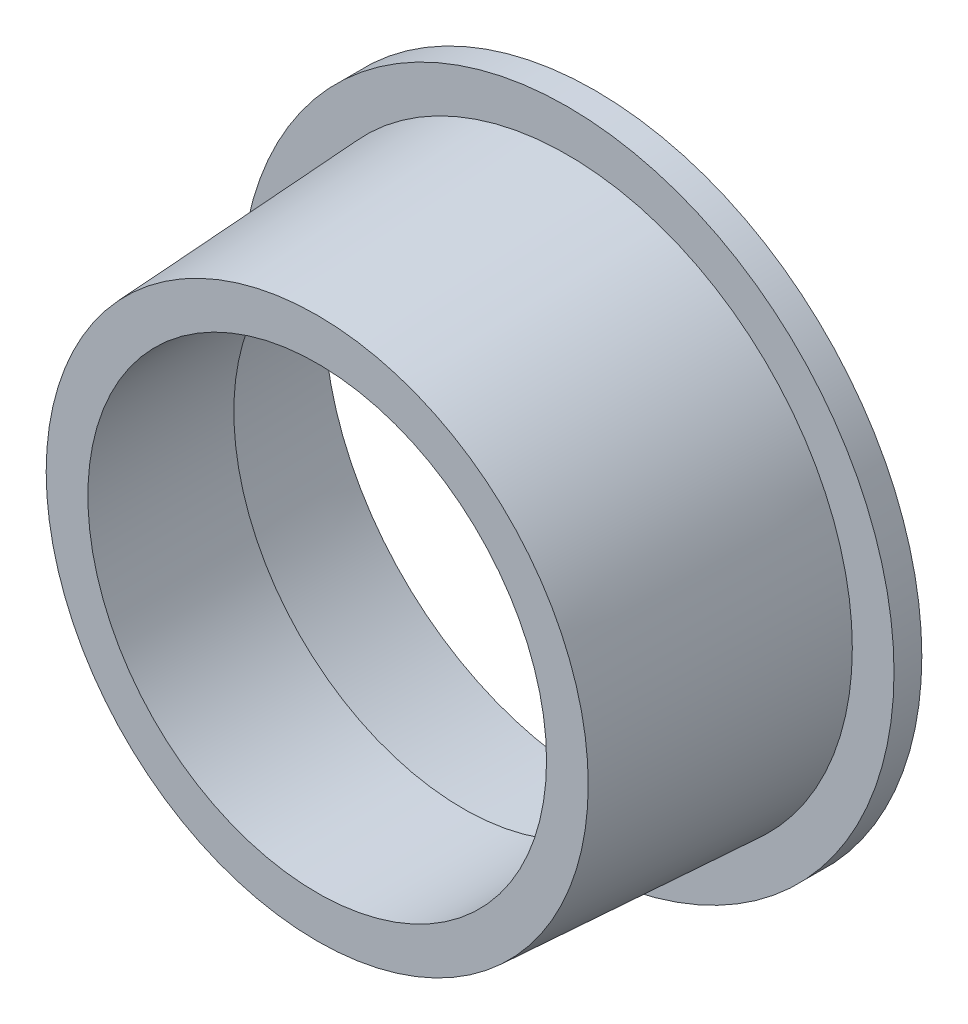
ISO-10303-21;
HEADER;
FILE_DESCRIPTION(('STEP AP214'),'2;1');
FILE_NAME('part.step','',(''),(''),'','','');
FILE_SCHEMA(('AUTOMOTIVE_DESIGN { 1 0 10303 214 1 1 1 1 }'));
ENDSEC;
DATA;
#1=APPLICATION_CONTEXT('core data for automotive mechanical design processes');
#2=APPLICATION_PROTOCOL_DEFINITION('international standard','automotive_design',2000,#1);
#3=PRODUCT_CONTEXT('',#1,'mechanical');
#4=PRODUCT('Part','Part','',(#3));
#5=PRODUCT_RELATED_PRODUCT_CATEGORY('part','',(#4));
#6=PRODUCT_DEFINITION_FORMATION('','',#4);
#7=PRODUCT_DEFINITION_CONTEXT('part definition',#1,'design');
#8=PRODUCT_DEFINITION('design','',#6,#7);
#9=PRODUCT_DEFINITION_SHAPE('','',#8);
#10=(LENGTH_UNIT() NAMED_UNIT(*) SI_UNIT(.MILLI.,.METRE.));
#11=(NAMED_UNIT(*) PLANE_ANGLE_UNIT() SI_UNIT($,.RADIAN.));
#12=(NAMED_UNIT(*) SI_UNIT($,.STERADIAN.) SOLID_ANGLE_UNIT());
#13=UNCERTAINTY_MEASURE_WITH_UNIT(LENGTH_MEASURE(1.E-05),#10,'distance_accuracy_value','');
#14=(GEOMETRIC_REPRESENTATION_CONTEXT(3) GLOBAL_UNCERTAINTY_ASSIGNED_CONTEXT((#13)) GLOBAL_UNIT_ASSIGNED_CONTEXT((#10,
#11,#12)) REPRESENTATION_CONTEXT('',''));
#15=CARTESIAN_POINT('',(0.,0.,0.));
#16=DIRECTION('',(0.,0.,1.));
#17=DIRECTION('',(1.,0.,0.));
#18=AXIS2_PLACEMENT_3D('',#15,#16,#17);
#19=CARTESIAN_POINT('',(-23.5,0.,0.));
#20=DIRECTION('',(0.,0.,1.));
#21=DIRECTION('',(1.,0.,0.));
#22=AXIS2_PLACEMENT_3D('',#19,#20,#21);
#23=PLANE('',#22);
#24=CARTESIAN_POINT('',(0.,0.,0.));
#25=DIRECTION('',(0.,0.,1.));
#26=DIRECTION('',(1.,0.,0.));
#27=AXIS2_PLACEMENT_3D('',#24,#25,#26);
#28=CIRCLE('',#27,23.5);
#29=CARTESIAN_POINT('',(23.5,0.,0.));
#30=VERTEX_POINT('',#29);
#31=EDGE_CURVE('E65',#30,#30,#28,.T.);
#32=ORIENTED_EDGE('',*,*,#31,.F.);
#33=EDGE_LOOP('',(#32));
#34=FACE_BOUND('',#33,.T.);
#35=CARTESIAN_POINT('',(0.,0.,0.));
#36=DIRECTION('',(0.,0.,1.));
#37=DIRECTION('',(1.,0.,0.));
#38=AXIS2_PLACEMENT_3D('',#35,#36,#37);
#39=CIRCLE('',#38,19.5);
#40=CARTESIAN_POINT('',(19.5,0.,0.));
#41=VERTEX_POINT('',#40);
#42=EDGE_CURVE('E10',#41,#41,#39,.T.);
#43=ORIENTED_EDGE('',*,*,#42,.T.);
#44=EDGE_LOOP('',(#43));
#45=FACE_BOUND('',#44,.T.);
#46=ADVANCED_FACE('F37',(#34,#45),#23,.F.);
#47=CARTESIAN_POINT('',(0.,0.,8.));
#48=DIRECTION('',(0.,0.,-1.));
#49=DIRECTION('',(-1.,0.,0.));
#50=AXIS2_PLACEMENT_3D('',#47,#48,#49);
#51=CONICAL_SURFACE('',#50,19.25,0.0312398334302679);
#52=ORIENTED_EDGE('',*,*,#42,.F.);
#53=EDGE_LOOP('',(#52));
#54=FACE_BOUND('',#53,.T.);
#55=CARTESIAN_POINT('',(0.,0.,8.));
#56=DIRECTION('',(0.,0.,1.));
#57=DIRECTION('',(1.,0.,0.));
#58=AXIS2_PLACEMENT_3D('',#55,#56,#57);
#59=CIRCLE('',#58,19.25);
#60=CARTESIAN_POINT('',(19.25,0.,8.));
#61=VERTEX_POINT('',#60);
#62=EDGE_CURVE('E43',#61,#61,#59,.T.);
#63=ORIENTED_EDGE('',*,*,#62,.T.);
#64=EDGE_LOOP('',(#63));
#65=FACE_BOUND('',#64,.T.);
#66=ADVANCED_FACE('F72',(#54,#65),#51,.F.);
#67=CARTESIAN_POINT('',(0.,0.,9.5));
#68=DIRECTION('',(0.,0.,-1.));
#69=DIRECTION('',(-1.,0.,0.));
#70=AXIS2_PLACEMENT_3D('',#67,#68,#69);
#71=CONICAL_SURFACE('',#70,16.5,1.07144960511477);
#72=ORIENTED_EDGE('',*,*,#62,.F.);
#73=EDGE_LOOP('',(#72));
#74=FACE_BOUND('',#73,.T.);
#75=CARTESIAN_POINT('',(0.,0.,9.5));
#76=DIRECTION('',(0.,0.,1.));
#77=DIRECTION('',(1.,0.,0.));
#78=AXIS2_PLACEMENT_3D('',#75,#76,#77);
#79=CIRCLE('',#78,16.5);
#80=CARTESIAN_POINT('',(16.5,0.,9.5));
#81=VERTEX_POINT('',#80);
#82=EDGE_CURVE('E47',#81,#81,#79,.T.);
#83=ORIENTED_EDGE('',*,*,#82,.T.);
#84=EDGE_LOOP('',(#83));
#85=FACE_BOUND('',#84,.T.);
#86=ADVANCED_FACE('F76',(#74,#85),#71,.F.);
#87=CARTESIAN_POINT('',(0.,0.,20.));
#88=DIRECTION('',(0.,0.,1.));
#89=DIRECTION('',(1.,0.,0.));
#90=AXIS2_PLACEMENT_3D('',#87,#88,#89);
#91=CYLINDRICAL_SURFACE('',#90,16.5);
#92=ORIENTED_EDGE('',*,*,#82,.F.);
#93=EDGE_LOOP('',(#92));
#94=FACE_BOUND('',#93,.T.);
#95=CARTESIAN_POINT('',(0.,0.,20.));
#96=DIRECTION('',(0.,0.,1.));
#97=DIRECTION('',(1.,0.,0.));
#98=AXIS2_PLACEMENT_3D('',#95,#96,#97);
#99=CIRCLE('',#98,16.5);
#100=CARTESIAN_POINT('',(16.5,0.,20.));
#101=VERTEX_POINT('',#100);
#102=EDGE_CURVE('E51',#101,#101,#99,.T.);
#103=ORIENTED_EDGE('',*,*,#102,.T.);
#104=EDGE_LOOP('',(#103));
#105=FACE_BOUND('',#104,.T.);
#106=ADVANCED_FACE('F81',(#94,#105),#91,.F.);
#107=CARTESIAN_POINT('',(-19.5,0.,20.));
#108=DIRECTION('',(0.,0.,-1.));
#109=DIRECTION('',(-1.,0.,0.));
#110=AXIS2_PLACEMENT_3D('',#107,#108,#109);
#111=PLANE('',#110);
#112=ORIENTED_EDGE('',*,*,#102,.F.);
#113=EDGE_LOOP('',(#112));
#114=FACE_BOUND('',#113,.T.);
#115=CARTESIAN_POINT('',(0.,0.,20.));
#116=DIRECTION('',(0.,0.,1.));
#117=DIRECTION('',(1.,0.,0.));
#118=AXIS2_PLACEMENT_3D('',#115,#116,#117);
#119=CIRCLE('',#118,19.5);
#120=CARTESIAN_POINT('',(19.5,0.,20.));
#121=VERTEX_POINT('',#120);
#122=EDGE_CURVE('E56',#121,#121,#119,.T.);
#123=ORIENTED_EDGE('',*,*,#122,.T.);
#124=EDGE_LOOP('',(#123));
#125=FACE_BOUND('',#124,.T.);
#126=ADVANCED_FACE('F87',(#114,#125),#111,.F.);
#127=CARTESIAN_POINT('',(0.,0.,2.));
#128=DIRECTION('',(0.,0.,-1.));
#129=DIRECTION('',(-1.,0.,0.));
#130=AXIS2_PLACEMENT_3D('',#127,#128,#129);
#131=CONICAL_SURFACE('',#130,20.5,0.0554985052457169);
#132=ORIENTED_EDGE('',*,*,#122,.F.);
#133=EDGE_LOOP('',(#132));
#134=FACE_BOUND('',#133,.T.);
#135=CARTESIAN_POINT('',(0.,0.,2.));
#136=DIRECTION('',(0.,0.,1.));
#137=DIRECTION('',(1.,0.,0.));
#138=AXIS2_PLACEMENT_3D('',#135,#136,#137);
#139=CIRCLE('',#138,20.5);
#140=CARTESIAN_POINT('',(20.5,0.,2.));
#141=VERTEX_POINT('',#140);
#142=EDGE_CURVE('E59',#141,#141,#139,.T.);
#143=ORIENTED_EDGE('',*,*,#142,.T.);
#144=EDGE_LOOP('',(#143));
#145=FACE_BOUND('',#144,.T.);
#146=ADVANCED_FACE('F91',(#134,#145),#131,.T.);
#147=CARTESIAN_POINT('',(-23.5,0.,2.));
#148=DIRECTION('',(0.,0.,-1.));
#149=DIRECTION('',(-1.,0.,0.));
#150=AXIS2_PLACEMENT_3D('',#147,#148,#149);
#151=PLANE('',#150);
#152=ORIENTED_EDGE('',*,*,#142,.F.);
#153=EDGE_LOOP('',(#152));
#154=FACE_BOUND('',#153,.T.);
#155=CARTESIAN_POINT('',(0.,0.,2.));
#156=DIRECTION('',(0.,0.,1.));
#157=DIRECTION('',(1.,0.,0.));
#158=AXIS2_PLACEMENT_3D('',#155,#156,#157);
#159=CIRCLE('',#158,23.5);
#160=CARTESIAN_POINT('',(23.5,0.,2.));
#161=VERTEX_POINT('',#160);
#162=EDGE_CURVE('E62',#161,#161,#159,.T.);
#163=ORIENTED_EDGE('',*,*,#162,.T.);
#164=EDGE_LOOP('',(#163));
#165=FACE_BOUND('',#164,.T.);
#166=ADVANCED_FACE('F95',(#154,#165),#151,.F.);
#167=CARTESIAN_POINT('',(0.,0.,20.));
#168=DIRECTION('',(0.,0.,1.));
#169=DIRECTION('',(1.,0.,0.));
#170=AXIS2_PLACEMENT_3D('',#167,#168,#169);
#171=CYLINDRICAL_SURFACE('',#170,23.5);
#172=ORIENTED_EDGE('',*,*,#162,.F.);
#173=EDGE_LOOP('',(#172));
#174=FACE_BOUND('',#173,.T.);
#175=ORIENTED_EDGE('',*,*,#31,.T.);
#176=EDGE_LOOP('',(#175));
#177=FACE_BOUND('',#176,.T.);
#178=ADVANCED_FACE('F69',(#174,#177),#171,.T.);
#179=CLOSED_SHELL('',(#46,#66,#86,#106,#126,#146,#166,#178));
#180=MANIFOLD_SOLID_BREP('B2',#179);
#181=ADVANCED_BREP_SHAPE_REPRESENTATION('',(#18,#180),#14);
#182=SHAPE_DEFINITION_REPRESENTATION(#9,#181);
ENDSEC;
END-ISO-10303-21;
